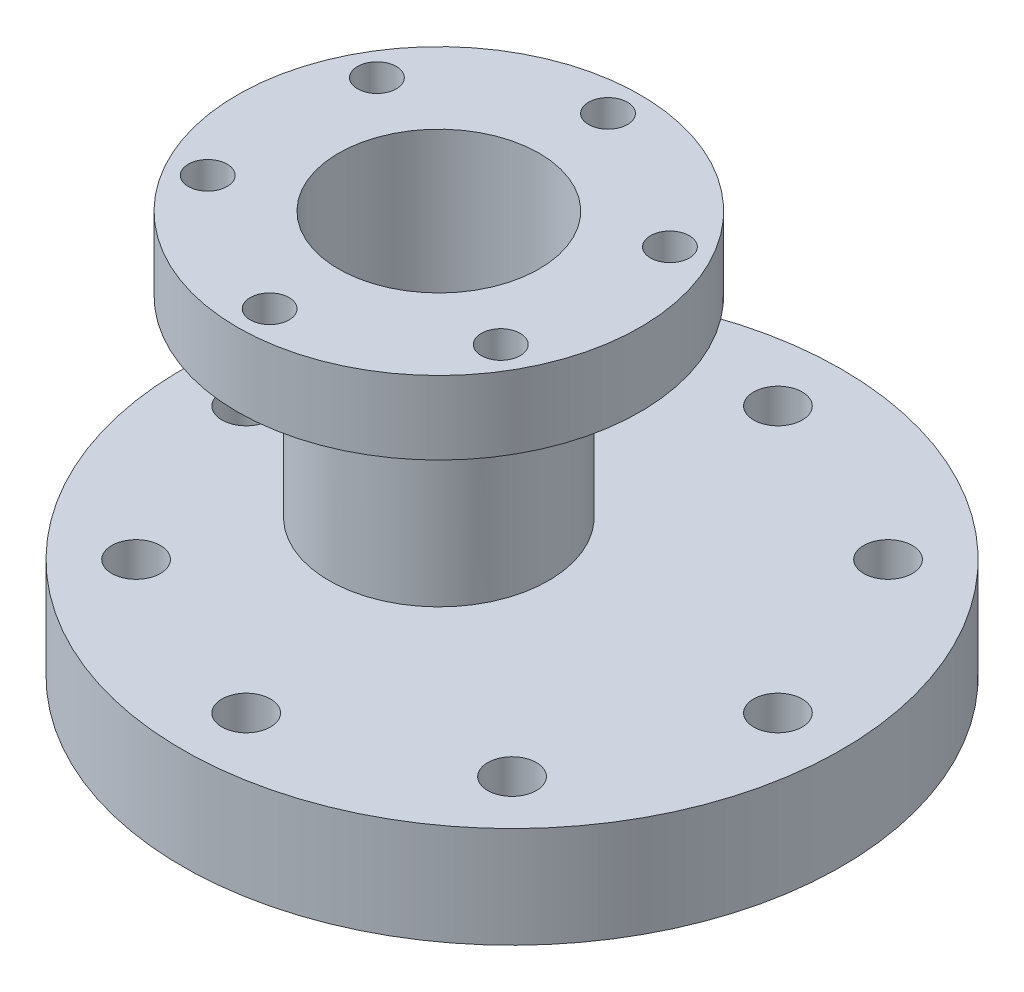
ISO-10303-21;
HEADER;
FILE_DESCRIPTION(('STEP AP214'),'2;1');
FILE_NAME('part.step','',(''),(''),'','','');
FILE_SCHEMA(('AUTOMOTIVE_DESIGN { 1 0 10303 214 1 1 1 1 }'));
ENDSEC;
DATA;
#1=APPLICATION_CONTEXT('core data for automotive mechanical design processes');
#2=APPLICATION_PROTOCOL_DEFINITION('international standard','automotive_design',2000,#1);
#3=PRODUCT_CONTEXT('',#1,'mechanical');
#4=PRODUCT('Part','Part','',(#3));
#5=PRODUCT_RELATED_PRODUCT_CATEGORY('part','',(#4));
#6=PRODUCT_DEFINITION_FORMATION('','',#4);
#7=PRODUCT_DEFINITION_CONTEXT('part definition',#1,'design');
#8=PRODUCT_DEFINITION('design','',#6,#7);
#9=PRODUCT_DEFINITION_SHAPE('','',#8);
#10=(LENGTH_UNIT() NAMED_UNIT(*) SI_UNIT(.MILLI.,.METRE.));
#11=(NAMED_UNIT(*) PLANE_ANGLE_UNIT() SI_UNIT($,.RADIAN.));
#12=(NAMED_UNIT(*) SI_UNIT($,.STERADIAN.) SOLID_ANGLE_UNIT());
#13=UNCERTAINTY_MEASURE_WITH_UNIT(LENGTH_MEASURE(1.E-05),#10,'distance_accuracy_value','');
#14=(GEOMETRIC_REPRESENTATION_CONTEXT(3) GLOBAL_UNCERTAINTY_ASSIGNED_CONTEXT((#13)) GLOBAL_UNIT_ASSIGNED_CONTEXT((#10,
#11,#12)) REPRESENTATION_CONTEXT('',''));
#15=CARTESIAN_POINT('',(0.,0.,0.));
#16=DIRECTION('',(0.,0.,1.));
#17=DIRECTION('',(1.,0.,0.));
#18=AXIS2_PLACEMENT_3D('',#15,#16,#17);
#19=CARTESIAN_POINT('',(12.7,-16.637,0.));
#20=DIRECTION('',(0.,-1.,0.));
#21=DIRECTION('',(0.,0.,-1.));
#22=AXIS2_PLACEMENT_3D('',#19,#20,#21);
#23=PLANE('',#22);
#24=CARTESIAN_POINT('',(58.801,-16.637,4.82253126321552E-13));
#25=DIRECTION('',(0.,-1.,0.));
#26=DIRECTION('',(0.,0.,-1.));
#27=AXIS2_PLACEMENT_3D('',#24,#25,#26);
#28=CIRCLE('',#27,4.2164);
#29=CARTESIAN_POINT('',(58.801,-16.637,-4.21639999999951));
#30=VERTEX_POINT('',#29);
#31=EDGE_CURVE('E133',#30,#30,#28,.T.);
#32=ORIENTED_EDGE('',*,*,#31,.T.);
#33=EDGE_LOOP('',(#32));
#34=FACE_BOUND('',#33,.T.);
#35=CARTESIAN_POINT('',(12.7000000000003,-16.637,-46.101));
#36=DIRECTION('',(0.,-1.,0.));
#37=DIRECTION('',(-1.,0.,0.));
#38=AXIS2_PLACEMENT_3D('',#35,#36,#37);
#39=CIRCLE('',#38,4.2164);
#40=CARTESIAN_POINT('',(8.48360000000033,-16.637,-46.101));
#41=VERTEX_POINT('',#40);
#42=EDGE_CURVE('E121',#41,#41,#39,.T.);
#43=ORIENTED_EDGE('',*,*,#42,.T.);
#44=EDGE_LOOP('',(#43));
#45=FACE_BOUND('',#44,.T.);
#46=CARTESIAN_POINT('',(-33.401,-16.637,-1.61329283265843E-13));
#47=DIRECTION('',(0.,-1.,0.));
#48=DIRECTION('',(0.,0.,1.));
#49=AXIS2_PLACEMENT_3D('',#46,#47,#48);
#50=CIRCLE('',#49,4.2164);
#51=CARTESIAN_POINT('',(-33.401,-16.637,4.21639999999984));
#52=VERTEX_POINT('',#51);
#53=EDGE_CURVE('E109',#52,#52,#50,.T.);
#54=ORIENTED_EDGE('',*,*,#53,.T.);
#55=EDGE_LOOP('',(#54));
#56=FACE_BOUND('',#55,.T.);
#57=CARTESIAN_POINT('',(12.7,-16.637,46.101));
#58=DIRECTION('',(0.,-1.,0.));
#59=DIRECTION('',(1.,0.,0.));
#60=AXIS2_PLACEMENT_3D('',#57,#58,#59);
#61=CIRCLE('',#60,4.2164);
#62=CARTESIAN_POINT('',(16.9164,-16.637,46.101));
#63=VERTEX_POINT('',#62);
#64=EDGE_CURVE('E97',#63,#63,#61,.T.);
#65=ORIENTED_EDGE('',*,*,#64,.T.);
#66=EDGE_LOOP('',(#65));
#67=FACE_BOUND('',#66,.T.);
#68=CARTESIAN_POINT('',(12.7,-16.637,0.));
#69=DIRECTION('',(0.,-1.,0.));
#70=DIRECTION('',(0.,0.,-1.));
#71=AXIS2_PLACEMENT_3D('',#68,#69,#70);
#72=CIRCLE('',#71,57.15);
#73=CARTESIAN_POINT('',(12.7,-16.637,-57.15));
#74=VERTEX_POINT('',#73);
#75=EDGE_CURVE('E49',#74,#74,#72,.T.);
#76=ORIENTED_EDGE('',*,*,#75,.F.);
#77=EDGE_LOOP('',(#76));
#78=FACE_BOUND('',#77,.T.);
#79=CARTESIAN_POINT('',(0.,-16.637,0.));
#80=DIRECTION('',(0.,-1.,0.));
#81=DIRECTION('',(0.,0.,-1.));
#82=AXIS2_PLACEMENT_3D('',#79,#80,#81);
#83=CIRCLE('',#82,19.05);
#84=CARTESIAN_POINT('',(0.,-16.637,-19.05));
#85=VERTEX_POINT('',#84);
#86=EDGE_CURVE('E44',#85,#85,#83,.T.);
#87=ORIENTED_EDGE('',*,*,#86,.T.);
#88=EDGE_LOOP('',(#87));
#89=FACE_BOUND('',#88,.T.);
#90=CARTESIAN_POINT('',(-19.8983297194811,-16.637,32.598329719481));
#91=DIRECTION('',(0.,-1.,0.));
#92=DIRECTION('',(0.707106781186546,0.,0.707106781186549));
#93=AXIS2_PLACEMENT_3D('',#90,#91,#92);
#94=CIRCLE('',#93,4.2164);
#95=CARTESIAN_POINT('',(-16.9168846872861,-16.637,35.5797747516759));
#96=VERTEX_POINT('',#95);
#97=EDGE_CURVE('E103',#96,#96,#94,.T.);
#98=ORIENTED_EDGE('',*,*,#97,.T.);
#99=EDGE_LOOP('',(#98));
#100=FACE_BOUND('',#99,.T.);
#101=CARTESIAN_POINT('',(-19.8983297194809,-16.637,-32.5983297194812));
#102=DIRECTION('',(0.,-1.,0.));
#103=DIRECTION('',(-0.707106781186551,0.,0.707106781186544));
#104=AXIS2_PLACEMENT_3D('',#101,#102,#103);
#105=CIRCLE('',#104,4.2164);
#106=CARTESIAN_POINT('',(-22.8797747516758,-16.637,-29.6168846872863));
#107=VERTEX_POINT('',#106);
#108=EDGE_CURVE('E115',#107,#107,#105,.T.);
#109=ORIENTED_EDGE('',*,*,#108,.T.);
#110=EDGE_LOOP('',(#109));
#111=FACE_BOUND('',#110,.T.);
#112=CARTESIAN_POINT('',(45.2983297194813,-16.637,-32.5983297194807));
#113=DIRECTION('',(0.,-1.,0.));
#114=DIRECTION('',(-0.707106781186541,0.,-0.707106781186554));
#115=AXIS2_PLACEMENT_3D('',#112,#113,#114);
#116=CIRCLE('',#115,4.2164);
#117=CARTESIAN_POINT('',(42.3168846872864,-16.637,-35.5797747516757));
#118=VERTEX_POINT('',#117);
#119=EDGE_CURVE('E127',#118,#118,#116,.T.);
#120=ORIENTED_EDGE('',*,*,#119,.T.);
#121=EDGE_LOOP('',(#120));
#122=FACE_BOUND('',#121,.T.);
#123=CARTESIAN_POINT('',(45.2983297194806,-16.637,32.5983297194814));
#124=DIRECTION('',(0.,-1.,0.));
#125=DIRECTION('',(0.707106781186556,0.,-0.707106781186539));
#126=AXIS2_PLACEMENT_3D('',#123,#124,#125);
#127=CIRCLE('',#126,4.2164);
#128=CARTESIAN_POINT('',(48.2797747516756,-16.637,29.6168846872865));
#129=VERTEX_POINT('',#128);
#130=EDGE_CURVE('E139',#129,#129,#127,.T.);
#131=ORIENTED_EDGE('',*,*,#130,.T.);
#132=EDGE_LOOP('',(#131));
#133=FACE_BOUND('',#132,.T.);
#134=ADVANCED_FACE('F28',(#34,#45,#56,#67,#78,#89,#100,#111,#122,#133),#23,.F.);
#135=CARTESIAN_POINT('',(12.7,-34.163,0.));
#136=DIRECTION('',(0.,-1.,0.));
#137=DIRECTION('',(0.,0.,-1.));
#138=AXIS2_PLACEMENT_3D('',#135,#136,#137);
#139=PLANE('',#138);
#140=CARTESIAN_POINT('',(58.801,-34.163,4.82253126321552E-13));
#141=DIRECTION('',(0.,-1.,0.));
#142=DIRECTION('',(0.,0.,-1.));
#143=AXIS2_PLACEMENT_3D('',#140,#141,#142);
#144=CIRCLE('',#143,4.2164);
#145=CARTESIAN_POINT('',(58.801,-34.163,-4.21639999999951));
#146=VERTEX_POINT('',#145);
#147=EDGE_CURVE('E130',#146,#146,#144,.T.);
#148=ORIENTED_EDGE('',*,*,#147,.F.);
#149=EDGE_LOOP('',(#148));
#150=FACE_BOUND('',#149,.T.);
#151=CARTESIAN_POINT('',(12.7000000000003,-34.163,-46.101));
#152=DIRECTION('',(0.,-1.,0.));
#153=DIRECTION('',(-1.,0.,0.));
#154=AXIS2_PLACEMENT_3D('',#151,#152,#153);
#155=CIRCLE('',#154,4.2164);
#156=CARTESIAN_POINT('',(8.48360000000033,-34.163,-46.101));
#157=VERTEX_POINT('',#156);
#158=EDGE_CURVE('E118',#157,#157,#155,.T.);
#159=ORIENTED_EDGE('',*,*,#158,.F.);
#160=EDGE_LOOP('',(#159));
#161=FACE_BOUND('',#160,.T.);
#162=CARTESIAN_POINT('',(-33.401,-34.163,-1.61329283265843E-13));
#163=DIRECTION('',(0.,-1.,0.));
#164=DIRECTION('',(0.,0.,1.));
#165=AXIS2_PLACEMENT_3D('',#162,#163,#164);
#166=CIRCLE('',#165,4.2164);
#167=CARTESIAN_POINT('',(-33.401,-34.163,4.21639999999984));
#168=VERTEX_POINT('',#167);
#169=EDGE_CURVE('E106',#168,#168,#166,.T.);
#170=ORIENTED_EDGE('',*,*,#169,.F.);
#171=EDGE_LOOP('',(#170));
#172=FACE_BOUND('',#171,.T.);
#173=CARTESIAN_POINT('',(12.7,-34.163,46.101));
#174=DIRECTION('',(0.,-1.,0.));
#175=DIRECTION('',(1.,0.,0.));
#176=AXIS2_PLACEMENT_3D('',#173,#174,#175);
#177=CIRCLE('',#176,4.2164);
#178=CARTESIAN_POINT('',(16.9164,-34.163,46.101));
#179=VERTEX_POINT('',#178);
#180=EDGE_CURVE('E94',#179,#179,#177,.T.);
#181=ORIENTED_EDGE('',*,*,#180,.F.);
#182=EDGE_LOOP('',(#181));
#183=FACE_BOUND('',#182,.T.);
#184=CARTESIAN_POINT('',(0.,-34.163,0.));
#185=DIRECTION('',(0.,-1.,0.));
#186=DIRECTION('',(0.,0.,-1.));
#187=AXIS2_PLACEMENT_3D('',#184,#185,#186);
#188=CIRCLE('',#187,17.399);
#189=CARTESIAN_POINT('',(0.,-34.163,-17.399));
#190=VERTEX_POINT('',#189);
#191=EDGE_CURVE('E57',#190,#190,#188,.T.);
#192=ORIENTED_EDGE('',*,*,#191,.F.);
#193=EDGE_LOOP('',(#192));
#194=FACE_BOUND('',#193,.T.);
#195=CARTESIAN_POINT('',(12.7,-34.163,0.));
#196=DIRECTION('',(0.,-1.,0.));
#197=DIRECTION('',(0.,0.,-1.));
#198=AXIS2_PLACEMENT_3D('',#195,#196,#197);
#199=CIRCLE('',#198,57.15);
#200=CARTESIAN_POINT('',(12.7,-34.163,-57.15));
#201=VERTEX_POINT('',#200);
#202=EDGE_CURVE('E48',#201,#201,#199,.T.);
#203=ORIENTED_EDGE('',*,*,#202,.T.);
#204=EDGE_LOOP('',(#203));
#205=FACE_BOUND('',#204,.T.);
#206=CARTESIAN_POINT('',(-19.8983297194811,-34.163,32.598329719481));
#207=DIRECTION('',(0.,-1.,0.));
#208=DIRECTION('',(0.707106781186546,0.,0.707106781186549));
#209=AXIS2_PLACEMENT_3D('',#206,#207,#208);
#210=CIRCLE('',#209,4.2164);
#211=CARTESIAN_POINT('',(-16.9168846872861,-34.163,35.5797747516759));
#212=VERTEX_POINT('',#211);
#213=EDGE_CURVE('E100',#212,#212,#210,.T.);
#214=ORIENTED_EDGE('',*,*,#213,.F.);
#215=EDGE_LOOP('',(#214));
#216=FACE_BOUND('',#215,.T.);
#217=CARTESIAN_POINT('',(-19.8983297194809,-34.163,-32.5983297194812));
#218=DIRECTION('',(0.,-1.,0.));
#219=DIRECTION('',(-0.707106781186551,0.,0.707106781186544));
#220=AXIS2_PLACEMENT_3D('',#217,#218,#219);
#221=CIRCLE('',#220,4.2164);
#222=CARTESIAN_POINT('',(-22.8797747516758,-34.163,-29.6168846872863));
#223=VERTEX_POINT('',#222);
#224=EDGE_CURVE('E112',#223,#223,#221,.T.);
#225=ORIENTED_EDGE('',*,*,#224,.F.);
#226=EDGE_LOOP('',(#225));
#227=FACE_BOUND('',#226,.T.);
#228=CARTESIAN_POINT('',(45.2983297194813,-34.163,-32.5983297194807));
#229=DIRECTION('',(0.,-1.,0.));
#230=DIRECTION('',(-0.707106781186541,0.,-0.707106781186554));
#231=AXIS2_PLACEMENT_3D('',#228,#229,#230);
#232=CIRCLE('',#231,4.2164);
#233=CARTESIAN_POINT('',(42.3168846872864,-34.163,-35.5797747516757));
#234=VERTEX_POINT('',#233);
#235=EDGE_CURVE('E124',#234,#234,#232,.T.);
#236=ORIENTED_EDGE('',*,*,#235,.F.);
#237=EDGE_LOOP('',(#236));
#238=FACE_BOUND('',#237,.T.);
#239=CARTESIAN_POINT('',(45.2983297194806,-34.163,32.5983297194814));
#240=DIRECTION('',(0.,-1.,0.));
#241=DIRECTION('',(0.707106781186556,0.,-0.707106781186539));
#242=AXIS2_PLACEMENT_3D('',#239,#240,#241);
#243=CIRCLE('',#242,4.2164);
#244=CARTESIAN_POINT('',(48.2797747516756,-34.163,29.6168846872865));
#245=VERTEX_POINT('',#244);
#246=EDGE_CURVE('E136',#245,#245,#243,.T.);
#247=ORIENTED_EDGE('',*,*,#246,.F.);
#248=EDGE_LOOP('',(#247));
#249=FACE_BOUND('',#248,.T.);
#250=ADVANCED_FACE('F148',(#150,#161,#172,#183,#194,#205,#216,#227,#238,#249),#139,.T.);
#251=CARTESIAN_POINT('',(0.,16.637,0.));
#252=DIRECTION('',(0.,1.,0.));
#253=DIRECTION('',(0.,0.,1.));
#254=AXIS2_PLACEMENT_3D('',#251,#252,#253);
#255=PLANE('',#254);
#256=CARTESIAN_POINT('',(-25.4065872708242,16.637,-14.6684999999998));
#257=DIRECTION('',(0.,1.,0.));
#258=DIRECTION('',(-0.866025403784443,0.,-0.499999999999992));
#259=AXIS2_PLACEMENT_3D('',#256,#257,#258);
#260=CIRCLE('',#259,3.3655);
#261=CARTESIAN_POINT('',(-28.3211957672608,16.637,-16.3512499999997));
#262=VERTEX_POINT('',#261);
#263=EDGE_CURVE('E85',#262,#262,#260,.T.);
#264=ORIENTED_EDGE('',*,*,#263,.T.);
#265=EDGE_LOOP('',(#264));
#266=FACE_BOUND('',#265,.T.);
#267=CARTESIAN_POINT('',(25.406587270824,16.637,-14.6685000000001));
#268=DIRECTION('',(0.,1.,0.));
#269=DIRECTION('',(0.866025403784436,0.,-0.500000000000004));
#270=AXIS2_PLACEMENT_3D('',#267,#268,#269);
#271=CIRCLE('',#270,3.3655);
#272=CARTESIAN_POINT('',(28.3211957672605,16.637,-16.3512500000001));
#273=VERTEX_POINT('',#272);
#274=EDGE_CURVE('E73',#273,#273,#271,.T.);
#275=ORIENTED_EDGE('',*,*,#274,.T.);
#276=EDGE_LOOP('',(#275));
#277=FACE_BOUND('',#276,.T.);
#278=CARTESIAN_POINT('',(0.,16.637,29.337));
#279=DIRECTION('',(0.,1.,0.));
#280=DIRECTION('',(0.,0.,1.));
#281=AXIS2_PLACEMENT_3D('',#278,#279,#280);
#282=CIRCLE('',#281,3.3655);
#283=CARTESIAN_POINT('',(0.,16.637,32.7025));
#284=VERTEX_POINT('',#283);
#285=EDGE_CURVE('E61',#284,#284,#282,.T.);
#286=ORIENTED_EDGE('',*,*,#285,.T.);
#287=EDGE_LOOP('',(#286));
#288=FACE_BOUND('',#287,.T.);
#289=CARTESIAN_POINT('',(0.,16.637,0.));
#290=DIRECTION('',(0.,1.,0.));
#291=DIRECTION('',(0.,0.,1.));
#292=AXIS2_PLACEMENT_3D('',#289,#290,#291);
#293=CIRCLE('',#292,34.925);
#294=CARTESIAN_POINT('',(0.,16.637,34.925));
#295=VERTEX_POINT('',#294);
#296=EDGE_CURVE('E39',#295,#295,#293,.T.);
#297=ORIENTED_EDGE('',*,*,#296,.F.);
#298=EDGE_LOOP('',(#297));
#299=FACE_BOUND('',#298,.T.);
#300=CARTESIAN_POINT('',(0.,16.637,0.));
#301=DIRECTION('',(0.,1.,0.));
#302=DIRECTION('',(0.,0.,1.));
#303=AXIS2_PLACEMENT_3D('',#300,#301,#302);
#304=CIRCLE('',#303,19.05);
#305=CARTESIAN_POINT('',(0.,16.637,19.05));
#306=VERTEX_POINT('',#305);
#307=EDGE_CURVE('E10',#306,#306,#304,.T.);
#308=ORIENTED_EDGE('',*,*,#307,.T.);
#309=EDGE_LOOP('',(#308));
#310=FACE_BOUND('',#309,.T.);
#311=CARTESIAN_POINT('',(25.4065872708241,16.637,14.6684999999999));
#312=DIRECTION('',(0.,1.,0.));
#313=DIRECTION('',(0.86602540378444,0.,0.499999999999998));
#314=AXIS2_PLACEMENT_3D('',#311,#312,#313);
#315=CIRCLE('',#314,3.3655);
#316=CARTESIAN_POINT('',(28.3211957672606,16.637,16.3512499999999));
#317=VERTEX_POINT('',#316);
#318=EDGE_CURVE('E67',#317,#317,#315,.T.);
#319=ORIENTED_EDGE('',*,*,#318,.T.);
#320=EDGE_LOOP('',(#319));
#321=FACE_BOUND('',#320,.T.);
#322=CARTESIAN_POINT('',(-2.04859294729732E-13,16.637,-29.337));
#323=DIRECTION('',(0.,1.,0.));
#324=DIRECTION('',(0.,0.,-1.));
#325=AXIS2_PLACEMENT_3D('',#322,#323,#324);
#326=CIRCLE('',#325,3.3655);
#327=CARTESIAN_POINT('',(-2.28360469233359E-13,16.637,-32.7025));
#328=VERTEX_POINT('',#327);
#329=EDGE_CURVE('E79',#328,#328,#326,.T.);
#330=ORIENTED_EDGE('',*,*,#329,.T.);
#331=EDGE_LOOP('',(#330));
#332=FACE_BOUND('',#331,.T.);
#333=CARTESIAN_POINT('',(-25.4065872708239,16.637,14.6685000000003));
#334=DIRECTION('',(0.,1.,0.));
#335=DIRECTION('',(-0.866025403784433,0.,0.50000000000001));
#336=AXIS2_PLACEMENT_3D('',#333,#334,#335);
#337=CIRCLE('',#336,3.3655);
#338=CARTESIAN_POINT('',(-28.3211957672604,16.637,16.3512500000003));
#339=VERTEX_POINT('',#338);
#340=EDGE_CURVE('E91',#339,#339,#337,.T.);
#341=ORIENTED_EDGE('',*,*,#340,.T.);
#342=EDGE_LOOP('',(#341));
#343=FACE_BOUND('',#342,.T.);
#344=ADVANCED_FACE('F150',(#266,#277,#288,#299,#310,#321,#332,#343),#255,.F.);
#345=CARTESIAN_POINT('',(0.,29.337,0.));
#346=DIRECTION('',(0.,1.,0.));
#347=DIRECTION('',(0.,0.,1.));
#348=AXIS2_PLACEMENT_3D('',#345,#346,#347);
#349=PLANE('',#348);
#350=CARTESIAN_POINT('',(-25.4065872708242,29.337,-14.6684999999998));
#351=DIRECTION('',(0.,1.,0.));
#352=DIRECTION('',(-0.866025403784443,0.,-0.499999999999992));
#353=AXIS2_PLACEMENT_3D('',#350,#351,#352);
#354=CIRCLE('',#353,3.3655);
#355=CARTESIAN_POINT('',(-28.3211957672608,29.337,-16.3512499999997));
#356=VERTEX_POINT('',#355);
#357=EDGE_CURVE('E82',#356,#356,#354,.T.);
#358=ORIENTED_EDGE('',*,*,#357,.F.);
#359=EDGE_LOOP('',(#358));
#360=FACE_BOUND('',#359,.T.);
#361=CARTESIAN_POINT('',(25.406587270824,29.337,-14.6685000000001));
#362=DIRECTION('',(0.,1.,0.));
#363=DIRECTION('',(0.866025403784436,0.,-0.500000000000004));
#364=AXIS2_PLACEMENT_3D('',#361,#362,#363);
#365=CIRCLE('',#364,3.3655);
#366=CARTESIAN_POINT('',(28.3211957672605,29.337,-16.3512500000001));
#367=VERTEX_POINT('',#366);
#368=EDGE_CURVE('E70',#367,#367,#365,.T.);
#369=ORIENTED_EDGE('',*,*,#368,.F.);
#370=EDGE_LOOP('',(#369));
#371=FACE_BOUND('',#370,.T.);
#372=CARTESIAN_POINT('',(0.,29.337,29.337));
#373=DIRECTION('',(0.,1.,0.));
#374=DIRECTION('',(0.,0.,1.));
#375=AXIS2_PLACEMENT_3D('',#372,#373,#374);
#376=CIRCLE('',#375,3.3655);
#377=CARTESIAN_POINT('',(0.,29.337,32.7025));
#378=VERTEX_POINT('',#377);
#379=EDGE_CURVE('E60',#378,#378,#376,.T.);
#380=ORIENTED_EDGE('',*,*,#379,.F.);
#381=EDGE_LOOP('',(#380));
#382=FACE_BOUND('',#381,.T.);
#383=CARTESIAN_POINT('',(0.,29.337,0.));
#384=DIRECTION('',(0.,-1.,0.));
#385=DIRECTION('',(0.,0.,-1.));
#386=AXIS2_PLACEMENT_3D('',#383,#384,#385);
#387=CIRCLE('',#386,17.399);
#388=CARTESIAN_POINT('',(0.,29.337,-17.399));
#389=VERTEX_POINT('',#388);
#390=EDGE_CURVE('E52',#389,#389,#387,.T.);
#391=ORIENTED_EDGE('',*,*,#390,.T.);
#392=EDGE_LOOP('',(#391));
#393=FACE_BOUND('',#392,.T.);
#394=CARTESIAN_POINT('',(0.,29.337,0.));
#395=DIRECTION('',(0.,1.,0.));
#396=DIRECTION('',(0.,0.,1.));
#397=AXIS2_PLACEMENT_3D('',#394,#395,#396);
#398=CIRCLE('',#397,34.925);
#399=CARTESIAN_POINT('',(0.,29.337,34.925));
#400=VERTEX_POINT('',#399);
#401=EDGE_CURVE('E35',#400,#400,#398,.T.);
#402=ORIENTED_EDGE('',*,*,#401,.T.);
#403=EDGE_LOOP('',(#402));
#404=FACE_BOUND('',#403,.T.);
#405=CARTESIAN_POINT('',(25.4065872708241,29.337,14.6684999999999));
#406=DIRECTION('',(0.,1.,0.));
#407=DIRECTION('',(0.86602540378444,0.,0.499999999999998));
#408=AXIS2_PLACEMENT_3D('',#405,#406,#407);
#409=CIRCLE('',#408,3.3655);
#410=CARTESIAN_POINT('',(28.3211957672606,29.337,16.3512499999999));
#411=VERTEX_POINT('',#410);
#412=EDGE_CURVE('E64',#411,#411,#409,.T.);
#413=ORIENTED_EDGE('',*,*,#412,.F.);
#414=EDGE_LOOP('',(#413));
#415=FACE_BOUND('',#414,.T.);
#416=CARTESIAN_POINT('',(-2.04859294729732E-13,29.337,-29.337));
#417=DIRECTION('',(0.,1.,0.));
#418=DIRECTION('',(0.,0.,-1.));
#419=AXIS2_PLACEMENT_3D('',#416,#417,#418);
#420=CIRCLE('',#419,3.3655);
#421=CARTESIAN_POINT('',(-2.28360469233359E-13,29.337,-32.7025));
#422=VERTEX_POINT('',#421);
#423=EDGE_CURVE('E76',#422,#422,#420,.T.);
#424=ORIENTED_EDGE('',*,*,#423,.F.);
#425=EDGE_LOOP('',(#424));
#426=FACE_BOUND('',#425,.T.);
#427=CARTESIAN_POINT('',(-25.4065872708239,29.337,14.6685000000003));
#428=DIRECTION('',(0.,1.,0.));
#429=DIRECTION('',(-0.866025403784433,0.,0.50000000000001));
#430=AXIS2_PLACEMENT_3D('',#427,#428,#429);
#431=CIRCLE('',#430,3.3655);
#432=CARTESIAN_POINT('',(-28.3211957672604,29.337,16.3512500000003));
#433=VERTEX_POINT('',#432);
#434=EDGE_CURVE('E88',#433,#433,#431,.T.);
#435=ORIENTED_EDGE('',*,*,#434,.F.);
#436=EDGE_LOOP('',(#435));
#437=FACE_BOUND('',#436,.T.);
#438=ADVANCED_FACE('F157',(#360,#371,#382,#393,#404,#415,#426,#437),#349,.T.);
#439=CARTESIAN_POINT('',(0.,16.637,0.));
#440=DIRECTION('',(0.,-1.,0.));
#441=DIRECTION('',(0.,0.,-1.));
#442=AXIS2_PLACEMENT_3D('',#439,#440,#441);
#443=CYLINDRICAL_SURFACE('',#442,19.05);
#444=ORIENTED_EDGE('',*,*,#307,.F.);
#445=EDGE_LOOP('',(#444));
#446=FACE_BOUND('',#445,.T.);
#447=ORIENTED_EDGE('',*,*,#86,.F.);
#448=EDGE_LOOP('',(#447));
#449=FACE_BOUND('',#448,.T.);
#450=ADVANCED_FACE('F30',(#446,#449),#443,.T.);
#451=CARTESIAN_POINT('',(0.,29.337,0.));
#452=DIRECTION('',(0.,-1.,0.));
#453=DIRECTION('',(0.,0.,-1.));
#454=AXIS2_PLACEMENT_3D('',#451,#452,#453);
#455=CYLINDRICAL_SURFACE('',#454,34.925);
#456=ORIENTED_EDGE('',*,*,#401,.F.);
#457=EDGE_LOOP('',(#456));
#458=FACE_BOUND('',#457,.T.);
#459=ORIENTED_EDGE('',*,*,#296,.T.);
#460=EDGE_LOOP('',(#459));
#461=FACE_BOUND('',#460,.T.);
#462=ADVANCED_FACE('F171',(#458,#461),#455,.T.);
#463=CARTESIAN_POINT('',(12.7,-34.163,0.));
#464=DIRECTION('',(0.,1.,0.));
#465=DIRECTION('',(0.,0.,1.));
#466=AXIS2_PLACEMENT_3D('',#463,#464,#465);
#467=CYLINDRICAL_SURFACE('',#466,57.15);
#468=ORIENTED_EDGE('',*,*,#202,.F.);
#469=EDGE_LOOP('',(#468));
#470=FACE_BOUND('',#469,.T.);
#471=ORIENTED_EDGE('',*,*,#75,.T.);
#472=EDGE_LOOP('',(#471));
#473=FACE_BOUND('',#472,.T.);
#474=ADVANCED_FACE('F168',(#470,#473),#467,.T.);
#475=CARTESIAN_POINT('',(0.,29.337,0.));
#476=DIRECTION('',(0.,-1.,0.));
#477=DIRECTION('',(0.,0.,-1.));
#478=AXIS2_PLACEMENT_3D('',#475,#476,#477);
#479=CYLINDRICAL_SURFACE('',#478,17.399);
#480=ORIENTED_EDGE('',*,*,#390,.F.);
#481=EDGE_LOOP('',(#480));
#482=FACE_BOUND('',#481,.T.);
#483=ORIENTED_EDGE('',*,*,#191,.T.);
#484=EDGE_LOOP('',(#483));
#485=FACE_BOUND('',#484,.T.);
#486=ADVANCED_FACE('F165',(#482,#485),#479,.F.);
#487=CARTESIAN_POINT('',(0.,29.337,29.337));
#488=DIRECTION('',(0.,-1.,0.));
#489=DIRECTION('',(0.,0.,-1.));
#490=AXIS2_PLACEMENT_3D('',#487,#488,#489);
#491=CYLINDRICAL_SURFACE('',#490,3.3655);
#492=ORIENTED_EDGE('',*,*,#379,.T.);
#493=EDGE_LOOP('',(#492));
#494=FACE_BOUND('',#493,.T.);
#495=ORIENTED_EDGE('',*,*,#285,.F.);
#496=EDGE_LOOP('',(#495));
#497=FACE_BOUND('',#496,.T.);
#498=ADVANCED_FACE('F218',(#494,#497),#491,.F.);
#499=CARTESIAN_POINT('',(25.4065872708241,29.337,14.6684999999999));
#500=DIRECTION('',(0.,-1.,0.));
#501=DIRECTION('',(0.,0.,-1.));
#502=AXIS2_PLACEMENT_3D('',#499,#500,#501);
#503=CYLINDRICAL_SURFACE('',#502,3.3655);
#504=ORIENTED_EDGE('',*,*,#412,.T.);
#505=EDGE_LOOP('',(#504));
#506=FACE_BOUND('',#505,.T.);
#507=ORIENTED_EDGE('',*,*,#318,.F.);
#508=EDGE_LOOP('',(#507));
#509=FACE_BOUND('',#508,.T.);
#510=ADVANCED_FACE('F215',(#506,#509),#503,.F.);
#511=CARTESIAN_POINT('',(25.406587270824,29.337,-14.6685000000001));
#512=DIRECTION('',(0.,-1.,0.));
#513=DIRECTION('',(0.,0.,-1.));
#514=AXIS2_PLACEMENT_3D('',#511,#512,#513);
#515=CYLINDRICAL_SURFACE('',#514,3.3655);
#516=ORIENTED_EDGE('',*,*,#368,.T.);
#517=EDGE_LOOP('',(#516));
#518=FACE_BOUND('',#517,.T.);
#519=ORIENTED_EDGE('',*,*,#274,.F.);
#520=EDGE_LOOP('',(#519));
#521=FACE_BOUND('',#520,.T.);
#522=ADVANCED_FACE('F211',(#518,#521),#515,.F.);
#523=CARTESIAN_POINT('',(-2.04859294729732E-13,29.337,-29.337));
#524=DIRECTION('',(0.,-1.,0.));
#525=DIRECTION('',(0.,0.,-1.));
#526=AXIS2_PLACEMENT_3D('',#523,#524,#525);
#527=CYLINDRICAL_SURFACE('',#526,3.3655);
#528=ORIENTED_EDGE('',*,*,#423,.T.);
#529=EDGE_LOOP('',(#528));
#530=FACE_BOUND('',#529,.T.);
#531=ORIENTED_EDGE('',*,*,#329,.F.);
#532=EDGE_LOOP('',(#531));
#533=FACE_BOUND('',#532,.T.);
#534=ADVANCED_FACE('F204',(#530,#533),#527,.F.);
#535=CARTESIAN_POINT('',(-25.4065872708242,29.337,-14.6684999999998));
#536=DIRECTION('',(0.,-1.,0.));
#537=DIRECTION('',(0.,0.,-1.));
#538=AXIS2_PLACEMENT_3D('',#535,#536,#537);
#539=CYLINDRICAL_SURFACE('',#538,3.3655);
#540=ORIENTED_EDGE('',*,*,#357,.T.);
#541=EDGE_LOOP('',(#540));
#542=FACE_BOUND('',#541,.T.);
#543=ORIENTED_EDGE('',*,*,#263,.F.);
#544=EDGE_LOOP('',(#543));
#545=FACE_BOUND('',#544,.T.);
#546=ADVANCED_FACE('F194',(#542,#545),#539,.F.);
#547=CARTESIAN_POINT('',(-25.4065872708239,29.337,14.6685000000003));
#548=DIRECTION('',(0.,-1.,0.));
#549=DIRECTION('',(0.,0.,-1.));
#550=AXIS2_PLACEMENT_3D('',#547,#548,#549);
#551=CYLINDRICAL_SURFACE('',#550,3.3655);
#552=ORIENTED_EDGE('',*,*,#434,.T.);
#553=EDGE_LOOP('',(#552));
#554=FACE_BOUND('',#553,.T.);
#555=ORIENTED_EDGE('',*,*,#340,.F.);
#556=EDGE_LOOP('',(#555));
#557=FACE_BOUND('',#556,.T.);
#558=ADVANCED_FACE('F191',(#554,#557),#551,.F.);
#559=CARTESIAN_POINT('',(12.7,-34.163,46.101));
#560=DIRECTION('',(0.,1.,0.));
#561=DIRECTION('',(0.,0.,1.));
#562=AXIS2_PLACEMENT_3D('',#559,#560,#561);
#563=CYLINDRICAL_SURFACE('',#562,4.2164);
#564=ORIENTED_EDGE('',*,*,#180,.T.);
#565=EDGE_LOOP('',(#564));
#566=FACE_BOUND('',#565,.T.);
#567=ORIENTED_EDGE('',*,*,#64,.F.);
#568=EDGE_LOOP('',(#567));
#569=FACE_BOUND('',#568,.T.);
#570=ADVANCED_FACE('F193',(#566,#569),#563,.F.);
#571=CARTESIAN_POINT('',(-19.8983297194811,-34.163,32.598329719481));
#572=DIRECTION('',(0.,1.,0.));
#573=DIRECTION('',(0.,0.,1.));
#574=AXIS2_PLACEMENT_3D('',#571,#572,#573);
#575=CYLINDRICAL_SURFACE('',#574,4.2164);
#576=ORIENTED_EDGE('',*,*,#213,.T.);
#577=EDGE_LOOP('',(#576));
#578=FACE_BOUND('',#577,.T.);
#579=ORIENTED_EDGE('',*,*,#97,.F.);
#580=EDGE_LOOP('',(#579));
#581=FACE_BOUND('',#580,.T.);
#582=ADVANCED_FACE('F201',(#578,#581),#575,.F.);
#583=CARTESIAN_POINT('',(-33.401,-34.163,-1.61329283265843E-13));
#584=DIRECTION('',(0.,1.,0.));
#585=DIRECTION('',(0.,0.,1.));
#586=AXIS2_PLACEMENT_3D('',#583,#584,#585);
#587=CYLINDRICAL_SURFACE('',#586,4.2164);
#588=ORIENTED_EDGE('',*,*,#169,.T.);
#589=EDGE_LOOP('',(#588));
#590=FACE_BOUND('',#589,.T.);
#591=ORIENTED_EDGE('',*,*,#53,.F.);
#592=EDGE_LOOP('',(#591));
#593=FACE_BOUND('',#592,.T.);
#594=ADVANCED_FACE('F277',(#590,#593),#587,.F.);
#595=CARTESIAN_POINT('',(-19.8983297194809,-34.163,-32.5983297194812));
#596=DIRECTION('',(0.,1.,0.));
#597=DIRECTION('',(0.,0.,1.));
#598=AXIS2_PLACEMENT_3D('',#595,#596,#597);
#599=CYLINDRICAL_SURFACE('',#598,4.2164);
#600=ORIENTED_EDGE('',*,*,#224,.T.);
#601=EDGE_LOOP('',(#600));
#602=FACE_BOUND('',#601,.T.);
#603=ORIENTED_EDGE('',*,*,#108,.F.);
#604=EDGE_LOOP('',(#603));
#605=FACE_BOUND('',#604,.T.);
#606=ADVANCED_FACE('F273',(#602,#605),#599,.F.);
#607=CARTESIAN_POINT('',(12.7000000000003,-34.163,-46.101));
#608=DIRECTION('',(0.,1.,0.));
#609=DIRECTION('',(0.,0.,1.));
#610=AXIS2_PLACEMENT_3D('',#607,#608,#609);
#611=CYLINDRICAL_SURFACE('',#610,4.2164);
#612=ORIENTED_EDGE('',*,*,#158,.T.);
#613=EDGE_LOOP('',(#612));
#614=FACE_BOUND('',#613,.T.);
#615=ORIENTED_EDGE('',*,*,#42,.F.);
#616=EDGE_LOOP('',(#615));
#617=FACE_BOUND('',#616,.T.);
#618=ADVANCED_FACE('F257',(#614,#617),#611,.F.);
#619=CARTESIAN_POINT('',(45.2983297194813,-34.163,-32.5983297194807));
#620=DIRECTION('',(0.,1.,0.));
#621=DIRECTION('',(0.,0.,1.));
#622=AXIS2_PLACEMENT_3D('',#619,#620,#621);
#623=CYLINDRICAL_SURFACE('',#622,4.2164);
#624=ORIENTED_EDGE('',*,*,#235,.T.);
#625=EDGE_LOOP('',(#624));
#626=FACE_BOUND('',#625,.T.);
#627=ORIENTED_EDGE('',*,*,#119,.F.);
#628=EDGE_LOOP('',(#627));
#629=FACE_BOUND('',#628,.T.);
#630=ADVANCED_FACE('F253',(#626,#629),#623,.F.);
#631=CARTESIAN_POINT('',(58.801,-34.163,4.82253126321552E-13));
#632=DIRECTION('',(0.,1.,0.));
#633=DIRECTION('',(0.,0.,1.));
#634=AXIS2_PLACEMENT_3D('',#631,#632,#633);
#635=CYLINDRICAL_SURFACE('',#634,4.2164);
#636=ORIENTED_EDGE('',*,*,#147,.T.);
#637=EDGE_LOOP('',(#636));
#638=FACE_BOUND('',#637,.T.);
#639=ORIENTED_EDGE('',*,*,#31,.F.);
#640=EDGE_LOOP('',(#639));
#641=FACE_BOUND('',#640,.T.);
#642=ADVANCED_FACE('F256',(#638,#641),#635,.F.);
#643=CARTESIAN_POINT('',(45.2983297194806,-34.163,32.5983297194814));
#644=DIRECTION('',(0.,1.,0.));
#645=DIRECTION('',(0.,0.,1.));
#646=AXIS2_PLACEMENT_3D('',#643,#644,#645);
#647=CYLINDRICAL_SURFACE('',#646,4.2164);
#648=ORIENTED_EDGE('',*,*,#246,.T.);
#649=EDGE_LOOP('',(#648));
#650=FACE_BOUND('',#649,.T.);
#651=ORIENTED_EDGE('',*,*,#130,.F.);
#652=EDGE_LOOP('',(#651));
#653=FACE_BOUND('',#652,.T.);
#654=ADVANCED_FACE('F145',(#650,#653),#647,.F.);
#655=CLOSED_SHELL('',(#134,#250,#344,#438,#450,#462,#474,#486,#498,#510,#522,#534,#546,#558,
#570,#582,#594,#606,#618,#630,#642,#654));
#656=MANIFOLD_SOLID_BREP('B2',#655);
#657=ADVANCED_BREP_SHAPE_REPRESENTATION('',(#18,#656),#14);
#658=SHAPE_DEFINITION_REPRESENTATION(#9,#657);
ENDSEC;
END-ISO-10303-21;
